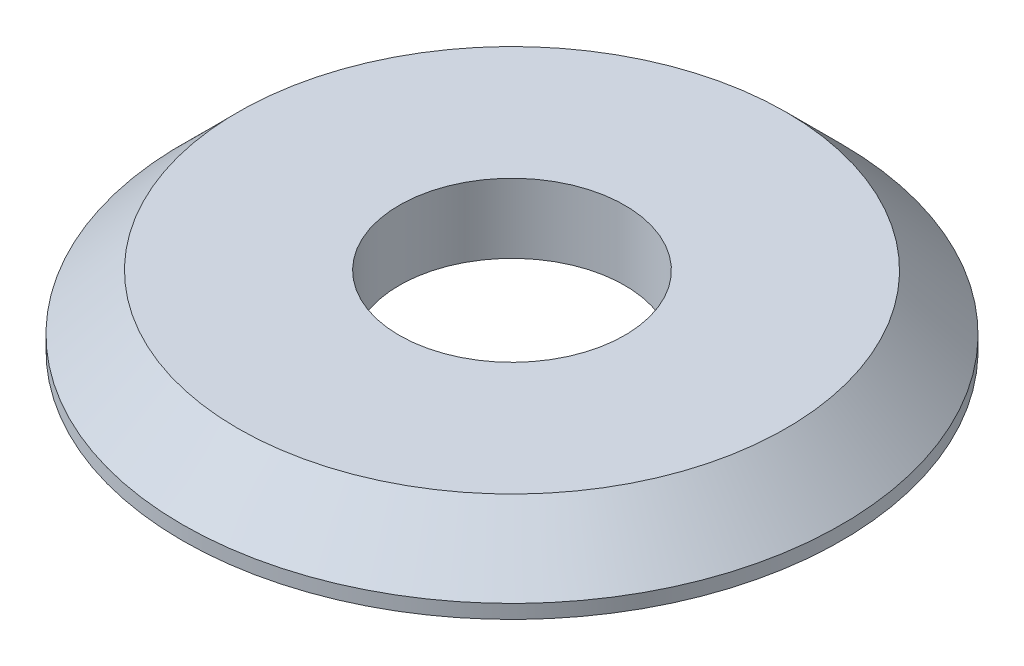
ISO-10303-21;
HEADER;
FILE_DESCRIPTION(('STEP AP214'),'2;1');
FILE_NAME('part.step','',(''),(''),'','','');
FILE_SCHEMA(('AUTOMOTIVE_DESIGN { 1 0 10303 214 1 1 1 1 }'));
ENDSEC;
DATA;
#1=APPLICATION_CONTEXT('core data for automotive mechanical design processes');
#2=APPLICATION_PROTOCOL_DEFINITION('international standard','automotive_design',2000,#1);
#3=PRODUCT_CONTEXT('',#1,'mechanical');
#4=PRODUCT('Part','Part','',(#3));
#5=PRODUCT_RELATED_PRODUCT_CATEGORY('part','',(#4));
#6=PRODUCT_DEFINITION_FORMATION('','',#4);
#7=PRODUCT_DEFINITION_CONTEXT('part definition',#1,'design');
#8=PRODUCT_DEFINITION('design','',#6,#7);
#9=PRODUCT_DEFINITION_SHAPE('','',#8);
#10=(LENGTH_UNIT() NAMED_UNIT(*) SI_UNIT(.MILLI.,.METRE.));
#11=(NAMED_UNIT(*) PLANE_ANGLE_UNIT() SI_UNIT($,.RADIAN.));
#12=(NAMED_UNIT(*) SI_UNIT($,.STERADIAN.) SOLID_ANGLE_UNIT());
#13=UNCERTAINTY_MEASURE_WITH_UNIT(LENGTH_MEASURE(1.E-05),#10,'distance_accuracy_value','');
#14=(GEOMETRIC_REPRESENTATION_CONTEXT(3) GLOBAL_UNCERTAINTY_ASSIGNED_CONTEXT((#13)) GLOBAL_UNIT_ASSIGNED_CONTEXT((#10,
#11,#12)) REPRESENTATION_CONTEXT('',''));
#15=CARTESIAN_POINT('',(0.,0.,0.));
#16=DIRECTION('',(0.,0.,1.));
#17=DIRECTION('',(1.,0.,0.));
#18=AXIS2_PLACEMENT_3D('',#15,#16,#17);
#19=CARTESIAN_POINT('',(0.,2.,0.));
#20=DIRECTION('',(0.,1.,0.));
#21=DIRECTION('',(0.,0.,1.));
#22=AXIS2_PLACEMENT_3D('',#19,#20,#21);
#23=PLANE('',#22);
#24=CARTESIAN_POINT('',(0.,2.,0.));
#25=DIRECTION('',(0.,1.,0.));
#26=DIRECTION('',(0.,0.,1.));
#27=AXIS2_PLACEMENT_3D('',#24,#25,#26);
#28=CIRCLE('',#27,7.9);
#29=CARTESIAN_POINT('',(0.,2.,7.9));
#30=VERTEX_POINT('',#29);
#31=EDGE_CURVE('E47',#30,#30,#28,.T.);
#32=ORIENTED_EDGE('',*,*,#31,.T.);
#33=EDGE_LOOP('',(#32));
#34=FACE_BOUND('',#33,.T.);
#35=CARTESIAN_POINT('',(0.,2.,0.));
#36=DIRECTION('',(0.,1.,0.));
#37=DIRECTION('',(0.,0.,1.));
#38=AXIS2_PLACEMENT_3D('',#35,#36,#37);
#39=CIRCLE('',#38,3.25);
#40=CARTESIAN_POINT('',(0.,2.,3.25));
#41=VERTEX_POINT('',#40);
#42=EDGE_CURVE('E55',#41,#41,#39,.T.);
#43=ORIENTED_EDGE('',*,*,#42,.F.);
#44=EDGE_LOOP('',(#43));
#45=FACE_BOUND('',#44,.T.);
#46=ADVANCED_FACE('F39',(#34,#45),#23,.T.);
#47=CARTESIAN_POINT('',(0.,0.,0.));
#48=DIRECTION('',(0.,1.,0.));
#49=DIRECTION('',(0.,0.,1.));
#50=AXIS2_PLACEMENT_3D('',#47,#48,#49);
#51=PLANE('',#50);
#52=CARTESIAN_POINT('',(0.,0.,0.));
#53=DIRECTION('',(0.,1.,0.));
#54=DIRECTION('',(0.,0.,1.));
#55=AXIS2_PLACEMENT_3D('',#52,#53,#54);
#56=CIRCLE('',#55,9.5);
#57=CARTESIAN_POINT('',(0.,0.,9.5));
#58=VERTEX_POINT('',#57);
#59=EDGE_CURVE('E51',#58,#58,#56,.T.);
#60=ORIENTED_EDGE('',*,*,#59,.F.);
#61=EDGE_LOOP('',(#60));
#62=FACE_BOUND('',#61,.T.);
#63=CARTESIAN_POINT('',(0.,0.,0.));
#64=DIRECTION('',(0.,1.,0.));
#65=DIRECTION('',(0.,0.,1.));
#66=AXIS2_PLACEMENT_3D('',#63,#64,#65);
#67=CIRCLE('',#66,3.25);
#68=CARTESIAN_POINT('',(0.,0.,3.25));
#69=VERTEX_POINT('',#68);
#70=EDGE_CURVE('E58',#69,#69,#67,.T.);
#71=ORIENTED_EDGE('',*,*,#70,.T.);
#72=EDGE_LOOP('',(#71));
#73=FACE_BOUND('',#72,.T.);
#74=ADVANCED_FACE('F68',(#62,#73),#51,.F.);
#75=CARTESIAN_POINT('',(0.,2.,0.));
#76=DIRECTION('',(0.,-1.,0.));
#77=DIRECTION('',(0.,0.,-1.));
#78=AXIS2_PLACEMENT_3D('',#75,#76,#77);
#79=CYLINDRICAL_SURFACE('',#78,9.5);
#80=CARTESIAN_POINT('',(0.,0.399999999999989,0.));
#81=DIRECTION('',(0.,1.,0.));
#82=DIRECTION('',(0.,0.,1.));
#83=AXIS2_PLACEMENT_3D('',#80,#81,#82);
#84=CIRCLE('',#83,9.5);
#85=CARTESIAN_POINT('',(0.,0.399999999999989,9.5));
#86=VERTEX_POINT('',#85);
#87=EDGE_CURVE('E10',#86,#86,#84,.F.);
#88=ORIENTED_EDGE('',*,*,#87,.T.);
#89=EDGE_LOOP('',(#88));
#90=FACE_BOUND('',#89,.T.);
#91=ORIENTED_EDGE('',*,*,#59,.T.);
#92=EDGE_LOOP('',(#91));
#93=FACE_BOUND('',#92,.T.);
#94=ADVANCED_FACE('F73',(#90,#93),#79,.T.);
#95=CARTESIAN_POINT('',(0.,2.,0.));
#96=DIRECTION('',(0.,-1.,0.));
#97=DIRECTION('',(0.,0.,-1.));
#98=AXIS2_PLACEMENT_3D('',#95,#96,#97);
#99=CYLINDRICAL_SURFACE('',#98,3.25);
#100=ORIENTED_EDGE('',*,*,#42,.T.);
#101=EDGE_LOOP('',(#100));
#102=FACE_BOUND('',#101,.T.);
#103=ORIENTED_EDGE('',*,*,#70,.F.);
#104=EDGE_LOOP('',(#103));
#105=FACE_BOUND('',#104,.T.);
#106=ADVANCED_FACE('F64',(#102,#105),#99,.F.);
#107=CARTESIAN_POINT('',(0.,2.,0.));
#108=DIRECTION('',(0.,-1.,0.));
#109=DIRECTION('',(0.,0.,-1.));
#110=AXIS2_PLACEMENT_3D('',#107,#108,#109);
#111=CONICAL_SURFACE('',#110,7.9,0.785398163397446);
#112=ORIENTED_EDGE('',*,*,#87,.F.);
#113=EDGE_LOOP('',(#112));
#114=FACE_BOUND('',#113,.T.);
#115=ORIENTED_EDGE('',*,*,#31,.F.);
#116=EDGE_LOOP('',(#115));
#117=FACE_BOUND('',#116,.T.);
#118=ADVANCED_FACE('F42',(#114,#117),#111,.T.);
#119=CLOSED_SHELL('',(#46,#74,#94,#106,#118));
#120=MANIFOLD_SOLID_BREP('B2',#119);
#121=ADVANCED_BREP_SHAPE_REPRESENTATION('',(#18,#120),#14);
#122=SHAPE_DEFINITION_REPRESENTATION(#9,#121);
ENDSEC;
END-ISO-10303-21;
